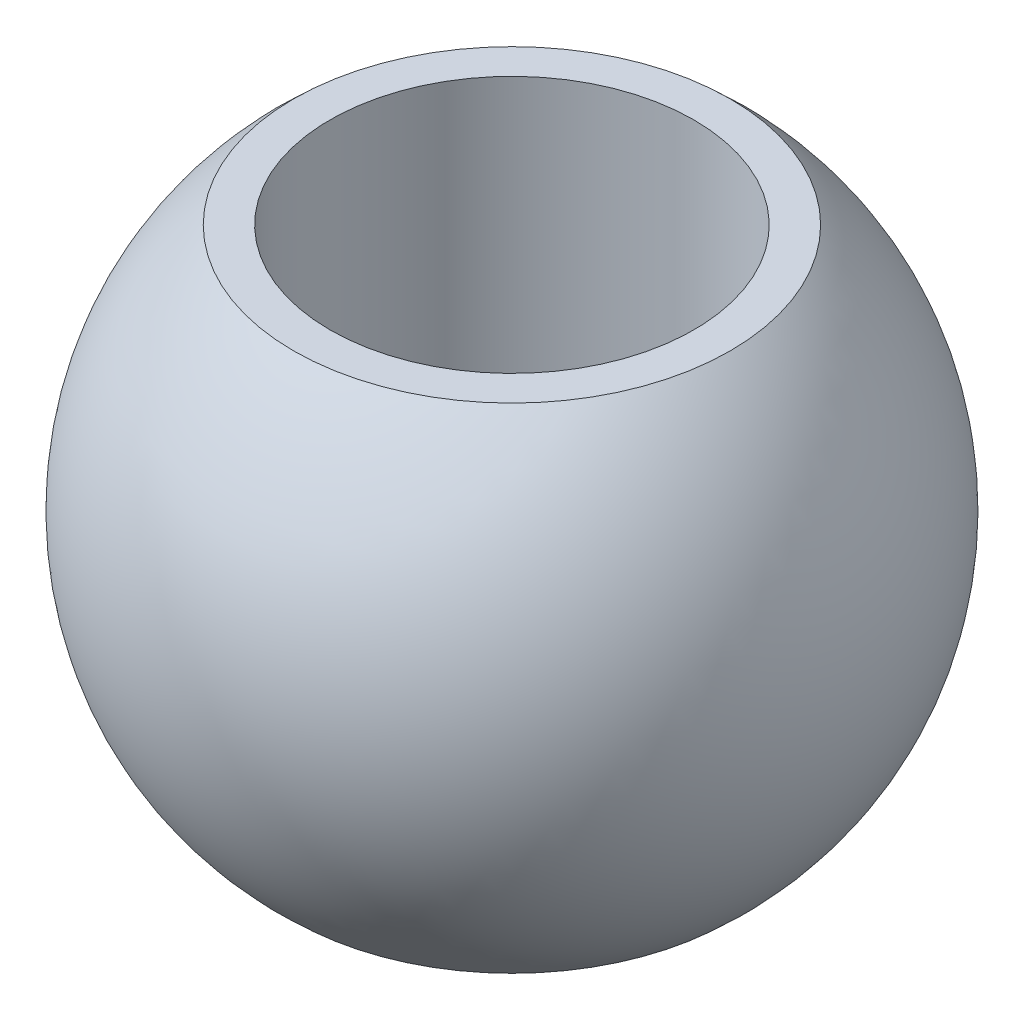
ISO-10303-21;
HEADER;
FILE_DESCRIPTION(('STEP AP214'),'2;1');
FILE_NAME('part.step','',(''),(''),'','','');
FILE_SCHEMA(('AUTOMOTIVE_DESIGN { 1 0 10303 214 1 1 1 1 }'));
ENDSEC;
DATA;
#1=APPLICATION_CONTEXT('core data for automotive mechanical design processes');
#2=APPLICATION_PROTOCOL_DEFINITION('international standard','automotive_design',2000,#1);
#3=PRODUCT_CONTEXT('',#1,'mechanical');
#4=PRODUCT('Part','Part','',(#3));
#5=PRODUCT_RELATED_PRODUCT_CATEGORY('part','',(#4));
#6=PRODUCT_DEFINITION_FORMATION('','',#4);
#7=PRODUCT_DEFINITION_CONTEXT('part definition',#1,'design');
#8=PRODUCT_DEFINITION('design','',#6,#7);
#9=PRODUCT_DEFINITION_SHAPE('','',#8);
#10=(LENGTH_UNIT() NAMED_UNIT(*) SI_UNIT(.MILLI.,.METRE.));
#11=(NAMED_UNIT(*) PLANE_ANGLE_UNIT() SI_UNIT($,.RADIAN.));
#12=(NAMED_UNIT(*) SI_UNIT($,.STERADIAN.) SOLID_ANGLE_UNIT());
#13=UNCERTAINTY_MEASURE_WITH_UNIT(LENGTH_MEASURE(1.E-05),#10,'distance_accuracy_value','');
#14=(GEOMETRIC_REPRESENTATION_CONTEXT(3) GLOBAL_UNCERTAINTY_ASSIGNED_CONTEXT((#13)) GLOBAL_UNIT_ASSIGNED_CONTEXT((#10,
#11,#12)) REPRESENTATION_CONTEXT('',''));
#15=CARTESIAN_POINT('',(0.,0.,0.));
#16=DIRECTION('',(0.,0.,1.));
#17=DIRECTION('',(1.,0.,0.));
#18=AXIS2_PLACEMENT_3D('',#15,#16,#17);
#19=CARTESIAN_POINT('',(7.,-9.5,0.));
#20=DIRECTION('',(0.,-1.,0.));
#21=DIRECTION('',(0.,0.,-1.));
#22=AXIS2_PLACEMENT_3D('',#19,#20,#21);
#23=PLANE('',#22);
#24=CARTESIAN_POINT('',(0.,-9.5,0.));
#25=DIRECTION('',(0.,-1.,0.));
#26=DIRECTION('',(0.,0.,-1.));
#27=AXIS2_PLACEMENT_3D('',#24,#25,#26);
#28=CIRCLE('',#27,8.39835698217216);
#29=CARTESIAN_POINT('',(8.39835698217217,-9.5,0.));
#30=VERTEX_POINT('',#29);
#31=EDGE_CURVE('E10',#30,#30,#28,.T.);
#32=ORIENTED_EDGE('',*,*,#31,.T.);
#33=EDGE_LOOP('',(#32));
#34=FACE_BOUND('',#33,.T.);
#35=CARTESIAN_POINT('',(0.,-9.5,0.));
#36=DIRECTION('',(0.,-1.,0.));
#37=DIRECTION('',(0.,0.,-1.));
#38=AXIS2_PLACEMENT_3D('',#35,#36,#37);
#39=CIRCLE('',#38,7.);
#40=CARTESIAN_POINT('',(0.,-9.5,-7.));
#41=VERTEX_POINT('',#40);
#42=EDGE_CURVE('E45',#41,#41,#39,.T.);
#43=ORIENTED_EDGE('',*,*,#42,.F.);
#44=EDGE_LOOP('',(#43));
#45=FACE_BOUND('',#44,.T.);
#46=ADVANCED_FACE('F31',(#34,#45),#23,.T.);
#47=CARTESIAN_POINT('',(0.,0.,0.));
#48=DIRECTION('',(0.,-1.,0.));
#49=DIRECTION('',(1.,0.,0.));
#50=AXIS2_PLACEMENT_3D('',#47,#48,#49);
#51=SPHERICAL_SURFACE('',#50,12.68);
#52=CARTESIAN_POINT('',(0.,9.5,0.));
#53=DIRECTION('',(0.,-1.,0.));
#54=DIRECTION('',(0.,0.,-1.));
#55=AXIS2_PLACEMENT_3D('',#52,#53,#54);
#56=CIRCLE('',#55,8.39835698217217);
#57=CARTESIAN_POINT('',(8.39835698217217,9.5,0.));
#58=VERTEX_POINT('',#57);
#59=EDGE_CURVE('E37',#58,#58,#56,.T.);
#60=CARTESIAN_POINT('',(8.39835698217217,9.5,0.));
#61=CARTESIAN_POINT('',(8.56597095026335,9.35183089300517,0.));
#62=CARTESIAN_POINT('',(8.72965540584639,9.19921764914504,0.));
#63=CARTESIAN_POINT('',(9.04872516597992,8.88554898587984,0.));
#64=CARTESIAN_POINT('',(9.20411047053043,8.72449356647477,0.));
#65=CARTESIAN_POINT('',(9.50614180258269,8.39438665030534,0.));
#66=CARTESIAN_POINT('',(9.65278783008444,8.22533515354098,0.));
#67=CARTESIAN_POINT('',(9.93693118802244,7.87971091257201,0.));
#68=CARTESIAN_POINT('',(10.0744285184587,7.70313816836739,0.));
#69=CARTESIAN_POINT('',(10.3398890176426,7.34296563079697,0.));
#70=CARTESIAN_POINT('',(10.4678521863903,7.15936583743116,0.));
#71=CARTESIAN_POINT('',(10.7138860486886,6.78565353654607,0.));
#72=CARTESIAN_POINT('',(10.8319567422392,6.59554102902678,0.));
#73=CARTESIAN_POINT('',(11.0578749283353,6.20933575421153,0.));
#74=CARTESIAN_POINT('',(11.1657224208807,6.01324298691556,0.));
#75=CARTESIAN_POINT('',(11.3708921451061,5.61562642950448,0.));
#76=CARTESIAN_POINT('',(11.4682143767861,5.41410263938937,0.));
#77=CARTESIAN_POINT('',(11.6520609906892,5.00618847612721,0.));
#78=CARTESIAN_POINT('',(11.7385853729123,4.79979810298017,0.));
#79=CARTESIAN_POINT('',(11.9005939449717,4.38272884644534,0.));
#80=CARTESIAN_POINT('',(11.976078134808,4.17204996305755,0.));
#81=CARTESIAN_POINT('',(12.1157949006735,3.7469937697574,0.));
#82=CARTESIAN_POINT('',(12.1800274767027,3.53261645984504,0.));
#83=CARTESIAN_POINT('',(12.2970611079898,3.10076385618659,0.));
#84=CARTESIAN_POINT('',(12.3498621632477,2.88328856244052,0.));
#85=CARTESIAN_POINT('',(12.4438848641701,2.44584911080577,0.));
#86=CARTESIAN_POINT('',(12.4851065098347,2.2258849529171,0.));
#87=CARTESIAN_POINT('',(12.5558549351639,1.78408386368155,0.));
#88=CARTESIAN_POINT('',(12.5853817148287,1.56224693233467,0.));
#89=CARTESIAN_POINT('',(12.6326577075304,1.11732163225605,0.));
#90=CARTESIAN_POINT('',(12.6504069205675,0.894233263524302,0.));
#91=CARTESIAN_POINT('',(12.6740780668022,0.447429929861704,0.));
#92=CARTESIAN_POINT('',(12.68,0.223714964930852,0.));
#93=CARTESIAN_POINT('',(12.68,-0.223714964930852,0.));
#94=CARTESIAN_POINT('',(12.6740780668022,-0.447429929861704,0.));
#95=CARTESIAN_POINT('',(12.6504069205675,-0.894233263524302,0.));
#96=CARTESIAN_POINT('',(12.6326577075304,-1.11732163225605,0.));
#97=CARTESIAN_POINT('',(12.5853817148287,-1.56224693233467,0.));
#98=CARTESIAN_POINT('',(12.5558549351639,-1.78408386368155,0.));
#99=CARTESIAN_POINT('',(12.4851065098347,-2.2258849529171,0.));
#100=CARTESIAN_POINT('',(12.4438848641701,-2.44584911080577,0.));
#101=CARTESIAN_POINT('',(12.3498621632477,-2.88328856244052,0.));
#102=CARTESIAN_POINT('',(12.2970611079898,-3.10076385618659,0.));
#103=CARTESIAN_POINT('',(12.1800274767027,-3.53261645984504,0.));
#104=CARTESIAN_POINT('',(12.1157949006735,-3.7469937697574,0.));
#105=CARTESIAN_POINT('',(11.976078134808,-4.17204996305755,0.));
#106=CARTESIAN_POINT('',(11.9005939449717,-4.38272884644534,0.));
#107=CARTESIAN_POINT('',(11.7385853729123,-4.79979810298017,0.));
#108=CARTESIAN_POINT('',(11.6520609906892,-5.00618847612721,0.));
#109=CARTESIAN_POINT('',(11.4682143767861,-5.41410263938937,0.));
#110=CARTESIAN_POINT('',(11.3708921451061,-5.61562642950448,0.));
#111=CARTESIAN_POINT('',(11.1657224208807,-6.01324298691556,0.));
#112=CARTESIAN_POINT('',(11.0578749283353,-6.20933575421153,0.));
#113=CARTESIAN_POINT('',(10.8319567422392,-6.59554102902678,0.));
#114=CARTESIAN_POINT('',(10.7138860486886,-6.78565353654607,0.));
#115=CARTESIAN_POINT('',(10.4678521863903,-7.15936583743116,0.));
#116=CARTESIAN_POINT('',(10.3398890176426,-7.34296563079697,0.));
#117=CARTESIAN_POINT('',(10.0744285184587,-7.70313816836739,0.));
#118=CARTESIAN_POINT('',(9.93693118802244,-7.87971091257201,0.));
#119=CARTESIAN_POINT('',(9.65278783008444,-8.22533515354098,0.));
#120=CARTESIAN_POINT('',(9.50614180258269,-8.39438665030534,0.));
#121=CARTESIAN_POINT('',(9.20411047053043,-8.72449356647477,0.));
#122=CARTESIAN_POINT('',(9.04872516597992,-8.88554898587984,0.));
#123=CARTESIAN_POINT('',(8.72965540584639,-9.19921764914504,0.));
#124=CARTESIAN_POINT('',(8.56597095026335,-9.35183089300516,0.));
#125=CARTESIAN_POINT('',(8.39835698217217,-9.5,0.));
#126=B_SPLINE_CURVE_WITH_KNOTS('',3,(#60,#61,#62,#63,#64,#65,#66,#67,#68,#69,#70,#71,#72,#73,
#74,#75,#76,#77,#78,#79,#80,#81,#82,#83,#84,#85,#86,#87,#88,#89,#90,#91,#92,#93,#94,#95,#96,#97,
#98,#99,#100,#101,#102,#103,#104,#105,#106,#107,#108,#109,#110,#111,#112,#113,#114,#115,#116,
#117,#118,#119,#120,#121,#122,#123,#124,#125),.UNSPECIFIED.,.F.,.F.,(4,2,2,2,2,2,2,2,2,2,2,2,2,
2,2,2,2,2,2,2,2,2,2,2,2,2,2,2,2,2,2,2,4),(0.,0.671066583993136,1.34213316798627,
2.01319975197941,2.68426633597254,3.35533291996568,4.02639950395881,4.69746608795195,
5.36853267194508,6.03959925593822,6.71066583993135,7.38173242392448,8.05279900791762,
8.72386559191076,9.39493217590389,10.065998759897,10.7370653438902,11.4081319278833,
12.0791985118764,12.7502650958696,13.4213316798627,14.0923982638558,14.763464847849,
15.4345314318421,16.1055980158352,16.7766645998284,17.4477311838215,18.1187977678147,
18.7898643518078,19.4609309358009,20.1319975197941,20.8030641037872,21.4741306877803),.UNSPECIFIED.);
#127=EDGE_CURVE('BSEAM55',#58,#30,#126,.T.);
#128=ORIENTED_EDGE('',*,*,#59,.T.);
#129=ORIENTED_EDGE('',*,*,#31,.F.);
#130=ORIENTED_EDGE('',*,*,#127,.T.);
#131=ORIENTED_EDGE('',*,*,#127,.F.);
#132=EDGE_LOOP('',(#128,#130,#129,#131));
#133=FACE_BOUND('',#132,.T.);
#134=ADVANCED_FACE('F55',(#133),#51,.T.);
#135=CARTESIAN_POINT('',(7.,9.5,0.));
#136=DIRECTION('',(0.,1.,0.));
#137=DIRECTION('',(0.,0.,1.));
#138=AXIS2_PLACEMENT_3D('',#135,#136,#137);
#139=PLANE('',#138);
#140=CARTESIAN_POINT('',(0.,9.5,0.));
#141=DIRECTION('',(0.,-1.,0.));
#142=DIRECTION('',(0.,0.,-1.));
#143=AXIS2_PLACEMENT_3D('',#140,#141,#142);
#144=CIRCLE('',#143,7.);
#145=CARTESIAN_POINT('',(0.,9.5,-7.));
#146=VERTEX_POINT('',#145);
#147=EDGE_CURVE('E41',#146,#146,#144,.T.);
#148=ORIENTED_EDGE('',*,*,#147,.T.);
#149=EDGE_LOOP('',(#148));
#150=FACE_BOUND('',#149,.T.);
#151=ORIENTED_EDGE('',*,*,#59,.F.);
#152=EDGE_LOOP('',(#151));
#153=FACE_BOUND('',#152,.T.);
#154=ADVANCED_FACE('F59',(#150,#153),#139,.T.);
#155=CARTESIAN_POINT('',(0.,-11.1,0.));
#156=DIRECTION('',(0.,-1.,0.));
#157=DIRECTION('',(0.,0.,-1.));
#158=AXIS2_PLACEMENT_3D('',#155,#156,#157);
#159=CYLINDRICAL_SURFACE('',#158,7.);
#160=ORIENTED_EDGE('',*,*,#42,.T.);
#161=EDGE_LOOP('',(#160));
#162=FACE_BOUND('',#161,.T.);
#163=ORIENTED_EDGE('',*,*,#147,.F.);
#164=EDGE_LOOP('',(#163));
#165=FACE_BOUND('',#164,.T.);
#166=ADVANCED_FACE('F51',(#162,#165),#159,.F.);
#167=CLOSED_SHELL('',(#46,#134,#154,#166));
#168=MANIFOLD_SOLID_BREP('B2',#167);
#169=ADVANCED_BREP_SHAPE_REPRESENTATION('',(#18,#168),#14);
#170=SHAPE_DEFINITION_REPRESENTATION(#9,#169);
ENDSEC;
END-ISO-10303-21;
